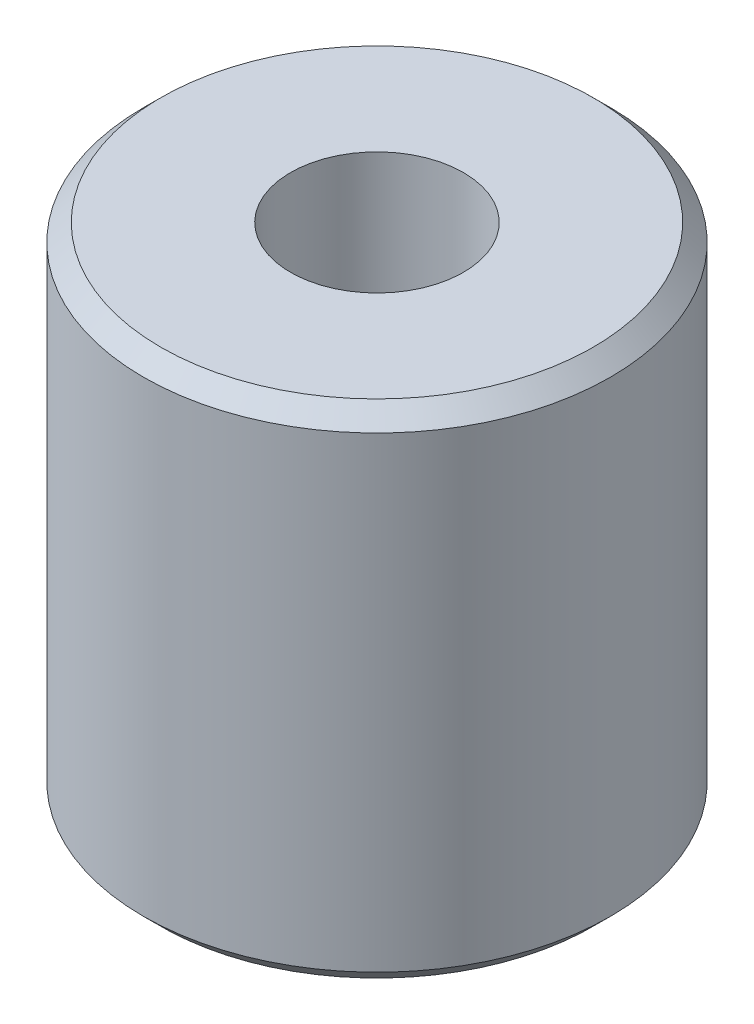
ISO-10303-21;
HEADER;
FILE_DESCRIPTION(('STEP AP214'),'2;1');
FILE_NAME('part.step','',(''),(''),'','','');
FILE_SCHEMA(('AUTOMOTIVE_DESIGN { 1 0 10303 214 1 1 1 1 }'));
ENDSEC;
DATA;
#1=APPLICATION_CONTEXT('core data for automotive mechanical design processes');
#2=APPLICATION_PROTOCOL_DEFINITION('international standard','automotive_design',2000,#1);
#3=PRODUCT_CONTEXT('',#1,'mechanical');
#4=PRODUCT('Part','Part','',(#3));
#5=PRODUCT_RELATED_PRODUCT_CATEGORY('part','',(#4));
#6=PRODUCT_DEFINITION_FORMATION('','',#4);
#7=PRODUCT_DEFINITION_CONTEXT('part definition',#1,'design');
#8=PRODUCT_DEFINITION('design','',#6,#7);
#9=PRODUCT_DEFINITION_SHAPE('','',#8);
#10=(LENGTH_UNIT() NAMED_UNIT(*) SI_UNIT(.MILLI.,.METRE.));
#11=(NAMED_UNIT(*) PLANE_ANGLE_UNIT() SI_UNIT($,.RADIAN.));
#12=(NAMED_UNIT(*) SI_UNIT($,.STERADIAN.) SOLID_ANGLE_UNIT());
#13=UNCERTAINTY_MEASURE_WITH_UNIT(LENGTH_MEASURE(1.E-05),#10,'distance_accuracy_value','');
#14=(GEOMETRIC_REPRESENTATION_CONTEXT(3) GLOBAL_UNCERTAINTY_ASSIGNED_CONTEXT((#13)) GLOBAL_UNIT_ASSIGNED_CONTEXT((#10,
#11,#12)) REPRESENTATION_CONTEXT('',''));
#15=CARTESIAN_POINT('',(0.,0.,0.));
#16=DIRECTION('',(0.,0.,1.));
#17=DIRECTION('',(1.,0.,0.));
#18=AXIS2_PLACEMENT_3D('',#15,#16,#17);
#19=CARTESIAN_POINT('',(0.,0.,0.));
#20=DIRECTION('',(0.,-1.,0.));
#21=DIRECTION('',(0.,0.,-1.));
#22=AXIS2_PLACEMENT_3D('',#19,#20,#21);
#23=PLANE('',#22);
#24=DIRECTION('',(-1.,0.,0.));
#25=VECTOR('',#24,1.);
#26=CARTESIAN_POINT('',(0.,0.,-12.2));
#27=LINE('',#26,#25);
#28=CARTESIAN_POINT('',(2.72213151776325,0.,-12.2));
#29=VERTEX_POINT('',#28);
#30=CARTESIAN_POINT('',(-2.72213151776325,0.,-12.2));
#31=VERTEX_POINT('',#30);
#32=EDGE_CURVE('E55',#29,#31,#27,.T.);
#33=ORIENTED_EDGE('',*,*,#32,.F.);
#34=CARTESIAN_POINT('',(0.,0.,0.));
#35=DIRECTION('',(0.,-1.,0.));
#36=DIRECTION('',(0.,0.,-1.));
#37=AXIS2_PLACEMENT_3D('',#34,#35,#36);
#38=CIRCLE('',#37,12.5);
#39=EDGE_CURVE('E104',#29,#31,#38,.T.);
#40=ORIENTED_EDGE('',*,*,#39,.T.);
#41=EDGE_LOOP('',(#33,#40));
#42=FACE_BOUND('',#41,.T.);
#43=CARTESIAN_POINT('',(0.,0.,0.));
#44=DIRECTION('',(0.,-1.,0.));
#45=DIRECTION('',(0.,0.,-1.));
#46=AXIS2_PLACEMENT_3D('',#43,#44,#45);
#47=CIRCLE('',#46,11.5);
#48=CARTESIAN_POINT('',(0.,0.,-11.5));
#49=VERTEX_POINT('',#48);
#50=EDGE_CURVE('E87',#49,#49,#47,.T.);
#51=ORIENTED_EDGE('',*,*,#50,.F.);
#52=EDGE_LOOP('',(#51));
#53=FACE_BOUND('',#52,.T.);
#54=ADVANCED_FACE('F37',(#42,#53),#23,.T.);
#55=CARTESIAN_POINT('',(0.,0.,0.));
#56=DIRECTION('',(0.,-1.,0.));
#57=DIRECTION('',(0.,0.,-1.));
#58=AXIS2_PLACEMENT_3D('',#55,#56,#57);
#59=CYLINDRICAL_SURFACE('',#58,13.5);
#60=DIRECTION('',(0.,-1.,0.));
#61=VECTOR('',#60,1.);
#62=CARTESIAN_POINT('',(-5.78013840664738,0.,-12.2));
#63=LINE('',#62,#61);
#64=CARTESIAN_POINT('',(-5.78013840664738,1.00000000000001,-12.2));
#65=VERTEX_POINT('',#64);
#66=CARTESIAN_POINT('',(-5.78013840664738,15.4544491975612,-12.2));
#67=VERTEX_POINT('',#66);
#68=EDGE_CURVE('E79',#65,#67,#63,.F.);
#69=ORIENTED_EDGE('',*,*,#68,.F.);
#70=CARTESIAN_POINT('',(0.,1.00000000000001,0.));
#71=DIRECTION('',(0.,-1.,0.));
#72=DIRECTION('',(0.,0.,-1.));
#73=AXIS2_PLACEMENT_3D('',#70,#71,#72);
#74=CIRCLE('',#73,13.5);
#75=CARTESIAN_POINT('',(5.78013840664738,1.00000000000001,-12.2));
#76=VERTEX_POINT('',#75);
#77=EDGE_CURVE('E86',#65,#76,#74,.F.);
#78=ORIENTED_EDGE('',*,*,#77,.T.);
#79=DIRECTION('',(0.,-1.,0.));
#80=VECTOR('',#79,1.);
#81=CARTESIAN_POINT('',(5.78013840664738,0.,-12.2));
#82=LINE('',#81,#80);
#83=CARTESIAN_POINT('',(5.78013840664738,15.4544491975612,-12.2));
#84=VERTEX_POINT('',#83);
#85=EDGE_CURVE('E61',#84,#76,#82,.T.);
#86=ORIENTED_EDGE('',*,*,#85,.F.);
#87=CARTESIAN_POINT('',(-5.7805605229943,15.4540777816083,-12.1998));
#88=CARTESIAN_POINT('',(-5.60377833499795,15.6096181417066,-12.2835547223903));
#89=CARTESIAN_POINT('',(-5.42153564305729,15.7602692502665,-12.3652085168867));
#90=CARTESIAN_POINT('',(-5.04560033762277,16.0504348255241,-12.523324280762));
#91=CARTESIAN_POINT('',(-4.85188464782954,16.1899254224025,-12.599775072566));
#92=CARTESIAN_POINT('',(-4.45138860053311,16.4569640822123,-12.7468047787695));
#93=CARTESIAN_POINT('',(-4.24450502799067,16.5843913573172,-12.8173236475341));
#94=CARTESIAN_POINT('',(-3.81953534537975,16.8237799133292,-12.9503159975259));
#95=CARTESIAN_POINT('',(-3.60145316737217,16.9357465725214,-13.0127922760146));
#96=CARTESIAN_POINT('',(-3.19547179540864,17.1232035257958,-13.1177183118308));
#97=CARTESIAN_POINT('',(-3.00933066214877,17.2016213039732,-13.1617418924223));
#98=CARTESIAN_POINT('',(-2.63061965718643,17.3454068127842,-13.2426319955222));
#99=CARTESIAN_POINT('',(-2.43805246627921,17.4107799078286,-13.2795014598702));
#100=CARTESIAN_POINT('',(-2.04798318554912,17.5271089671152,-13.3452142141676));
#101=CARTESIAN_POINT('',(-1.85050009701545,17.578113186183,-13.3740843626105));
#102=CARTESIAN_POINT('',(-1.45116311219461,17.6649400024044,-13.4232852854299));
#103=CARTESIAN_POINT('',(-1.24930933217448,17.7007630028814,-13.4436162866678));
#104=CARTESIAN_POINT('',(-0.84122570506277,17.756608663976,-13.4753299277904));
#105=CARTESIAN_POINT('',(-0.634974811241519,17.7765156701302,-13.4866470657182));
#106=CARTESIAN_POINT('',(-0.221228827746882,17.7996037202947,-13.4997738775742));
#107=CARTESIAN_POINT('',(-0.0137337250657907,17.8027845891337,-13.5015834519305));
#108=CARTESIAN_POINT('',(0.400744320794949,17.7923377784026,-13.4956427539284));
#109=CARTESIAN_POINT('',(0.607727121305969,17.7787058512224,-13.4878900657455));
#110=CARTESIAN_POINT('',(1.0193593421651,17.7349698678994,-13.4630392251003));
#111=CARTESIAN_POINT('',(1.22400885679909,17.7048664797783,-13.4459414516404));
#112=CARTESIAN_POINT('',(1.61143907482337,17.6322714018055,-13.4047672808428));
#113=CARTESIAN_POINT('',(1.79455206519561,17.5911121459458,-13.3814425706684));
#114=CARTESIAN_POINT('',(2.15655900159296,17.496464736852,-13.3278951480671));
#115=CARTESIAN_POINT('',(2.33545147454067,17.4429723471858,-13.2976700653968));
#116=CARTESIAN_POINT('',(2.86518708955981,17.2650459459745,-13.1973394229946));
#117=CARTESIAN_POINT('',(3.20853338584111,17.1232705211098,-13.1176399980038));
#118=CARTESIAN_POINT('',(3.95379346332797,16.7609880187799,-12.9152000131658));
#119=CARTESIAN_POINT('',(4.34871972273771,16.5296475571014,-12.7866757805522));
#120=CARTESIAN_POINT('',(5.09587075188603,16.0221690645189,-12.5075868659291));
#121=CARTESIAN_POINT('',(5.44838549745121,15.7463694720059,-12.3571894754937));
#122=CARTESIAN_POINT('',(5.7805605229944,15.4540777816082,-12.1998));
#123=B_SPLINE_CURVE_WITH_KNOTS('',3,(#87,#88,#89,#90,#91,#92,#93,#94,#95,#96,#97,#98,#99,#100,
#101,#102,#103,#104,#105,#106,#107,#108,#109,#110,#111,#112,#113,#114,#115,#116,#117,#118,#119,
#120,#121,#122),.UNSPECIFIED.,.F.,.F.,(4,2,2,2,2,2,2,2,2,2,2,2,2,2,2,2,2,4),(0.,
0.749814964274005,1.50119297451126,2.25943754684067,3.01741768047873,3.63702111516616,
4.25636922064916,4.87361188415865,5.4908381481986,6.11250976353929,6.73418788957804,
7.35602310949683,7.97783311194137,8.54460268000425,9.11156722427166,10.2471848575478,
11.668408519565,13.0792841562995),.UNSPECIFIED.);
#124=EDGE_CURVE('E11',#67,#84,#123,.T.);
#125=ORIENTED_EDGE('',*,*,#124,.F.);
#126=EDGE_LOOP('',(#69,#78,#86,#125));
#127=FACE_BOUND('',#126,.T.);
#128=CARTESIAN_POINT('',(0.,28.,0.));
#129=DIRECTION('',(0.,1.,0.));
#130=DIRECTION('',(0.,0.,1.));
#131=AXIS2_PLACEMENT_3D('',#128,#129,#130);
#132=CIRCLE('',#131,13.5);
#133=CARTESIAN_POINT('',(0.,28.,13.5));
#134=VERTEX_POINT('',#133);
#135=EDGE_CURVE('E98',#134,#134,#132,.F.);
#136=ORIENTED_EDGE('',*,*,#135,.T.);
#137=EDGE_LOOP('',(#136));
#138=FACE_BOUND('',#137,.T.);
#139=ADVANCED_FACE('F83',(#127,#138),#59,.T.);
#140=CARTESIAN_POINT('',(13.5,29.,0.));
#141=DIRECTION('',(0.,1.,0.));
#142=DIRECTION('',(0.,0.,1.));
#143=AXIS2_PLACEMENT_3D('',#140,#141,#142);
#144=PLANE('',#143);
#145=CARTESIAN_POINT('',(0.,29.,0.));
#146=DIRECTION('',(0.,-1.,0.));
#147=DIRECTION('',(0.,0.,-1.));
#148=AXIS2_PLACEMENT_3D('',#145,#146,#147);
#149=CIRCLE('',#148,5.);
#150=CARTESIAN_POINT('',(0.,29.,-5.));
#151=VERTEX_POINT('',#150);
#152=EDGE_CURVE('E151',#151,#151,#149,.T.);
#153=ORIENTED_EDGE('',*,*,#152,.T.);
#154=EDGE_LOOP('',(#153));
#155=FACE_BOUND('',#154,.T.);
#156=CARTESIAN_POINT('',(0.,29.,0.));
#157=DIRECTION('',(0.,1.,0.));
#158=DIRECTION('',(0.,0.,1.));
#159=AXIS2_PLACEMENT_3D('',#156,#157,#158);
#160=CIRCLE('',#159,12.5);
#161=CARTESIAN_POINT('',(0.,29.,12.5));
#162=VERTEX_POINT('',#161);
#163=EDGE_CURVE('E101',#162,#162,#160,.T.);
#164=ORIENTED_EDGE('',*,*,#163,.T.);
#165=EDGE_LOOP('',(#164));
#166=FACE_BOUND('',#165,.T.);
#167=ADVANCED_FACE('F129',(#155,#166),#144,.T.);
#168=CARTESIAN_POINT('',(0.,4.,0.));
#169=DIRECTION('',(0.,-1.,0.));
#170=DIRECTION('',(0.,0.,-1.));
#171=AXIS2_PLACEMENT_3D('',#168,#169,#170);
#172=CYLINDRICAL_SURFACE('',#171,11.5);
#173=CARTESIAN_POINT('',(0.,4.,0.));
#174=DIRECTION('',(0.,-1.,0.));
#175=DIRECTION('',(0.,0.,-1.));
#176=AXIS2_PLACEMENT_3D('',#173,#174,#175);
#177=CIRCLE('',#176,11.5);
#178=CARTESIAN_POINT('',(0.,4.,-11.5));
#179=VERTEX_POINT('',#178);
#180=EDGE_CURVE('E90',#179,#179,#177,.T.);
#181=ORIENTED_EDGE('',*,*,#180,.F.);
#182=EDGE_LOOP('',(#181));
#183=FACE_BOUND('',#182,.T.);
#184=ORIENTED_EDGE('',*,*,#50,.T.);
#185=EDGE_LOOP('',(#184));
#186=FACE_BOUND('',#185,.T.);
#187=ADVANCED_FACE('F125',(#183,#186),#172,.F.);
#188=CARTESIAN_POINT('',(0.,4.,0.));
#189=DIRECTION('',(0.,-1.,0.));
#190=DIRECTION('',(0.,0.,-1.));
#191=AXIS2_PLACEMENT_3D('',#188,#189,#190);
#192=PLANE('',#191);
#193=CARTESIAN_POINT('',(0.,4.,0.));
#194=DIRECTION('',(0.,-1.,0.));
#195=DIRECTION('',(0.,0.,-1.));
#196=AXIS2_PLACEMENT_3D('',#193,#194,#195);
#197=CIRCLE('',#196,8.);
#198=CARTESIAN_POINT('',(0.,4.,-8.));
#199=VERTEX_POINT('',#198);
#200=EDGE_CURVE('E148',#199,#199,#197,.T.);
#201=ORIENTED_EDGE('',*,*,#200,.F.);
#202=EDGE_LOOP('',(#201));
#203=FACE_BOUND('',#202,.T.);
#204=ORIENTED_EDGE('',*,*,#180,.T.);
#205=EDGE_LOOP('',(#204));
#206=FACE_BOUND('',#205,.T.);
#207=ADVANCED_FACE('F121',(#203,#206),#192,.T.);
#208=CARTESIAN_POINT('',(0.,28.,0.));
#209=DIRECTION('',(0.,-1.,0.));
#210=DIRECTION('',(0.,0.,-1.));
#211=AXIS2_PLACEMENT_3D('',#208,#209,#210);
#212=CONICAL_SURFACE('',#211,13.5,0.785398163397448);
#213=ORIENTED_EDGE('',*,*,#163,.F.);
#214=EDGE_LOOP('',(#213));
#215=FACE_BOUND('',#214,.T.);
#216=ORIENTED_EDGE('',*,*,#135,.F.);
#217=EDGE_LOOP('',(#216));
#218=FACE_BOUND('',#217,.T.);
#219=ADVANCED_FACE('F117',(#215,#218),#212,.T.);
#220=CARTESIAN_POINT('',(0.,0.,0.));
#221=DIRECTION('',(0.,1.,0.));
#222=DIRECTION('',(0.,0.,1.));
#223=AXIS2_PLACEMENT_3D('',#220,#221,#222);
#224=CONICAL_SURFACE('',#223,12.5,0.785398163397447);
#225=CARTESIAN_POINT('',(-9.37176828665042,2.88408400973769,-12.2));
#226=CARTESIAN_POINT('',(-9.14267745207639,2.74454545763472,-12.2));
#227=CARTESIAN_POINT('',(-8.91215854856363,2.60731543729206,-12.2));
#228=CARTESIAN_POINT('',(-8.44795301301165,2.33819296271562,-12.2));
#229=CARTESIAN_POINT('',(-8.21426561098258,2.20630183810872,-12.2));
#230=CARTESIAN_POINT('',(-7.74252932159776,1.94810270374058,-12.2));
#231=CARTESIAN_POINT('',(-7.50446616942464,1.82182066226694,-12.2));
#232=CARTESIAN_POINT('',(-7.0247149767949,1.57636774438777,-12.2));
#233=CARTESIAN_POINT('',(-6.78302717525875,1.45719640183275,-12.2));
#234=CARTESIAN_POINT('',(-6.29092370764107,1.22471419302888,-12.2));
#235=CARTESIAN_POINT('',(-6.04043007176325,1.11156718990535,-12.2));
#236=CARTESIAN_POINT('',(-5.53526149272942,0.895036357905515,-12.2));
#237=CARTESIAN_POINT('',(-5.28058618015263,0.791653397118208,-12.2));
#238=CARTESIAN_POINT('',(-4.51093332233905,0.498612909588109,-12.2));
#239=CARTESIAN_POINT('',(-3.98932969447108,0.325580054010307,-12.2));
#240=CARTESIAN_POINT('',(-3.15607966554564,0.0982260840564814,-12.2));
#241=CARTESIAN_POINT('',(-2.84960335796196,0.0247293674856625,-12.2));
#242=CARTESIAN_POINT('',(-2.23225572118263,-0.101140306041423,-12.2));
#243=CARTESIAN_POINT('',(-1.92138417853936,-0.153512233433383,-12.2));
#244=CARTESIAN_POINT('',(-1.2994545364014,-0.234828063240896,-12.2));
#245=CARTESIAN_POINT('',(-0.988424110140089,-0.263981715092129,-12.2));
#246=CARTESIAN_POINT('',(-0.365031777384046,-0.298509352151343,-12.2));
#247=CARTESIAN_POINT('',(-0.0526698395893691,-0.303882775235636,-12.2));
#248=CARTESIAN_POINT('',(0.624864186325084,-0.289466292503665,-12.2));
#249=CARTESIAN_POINT('',(0.989948166325427,-0.265223908670282,-12.2));
#250=CARTESIAN_POINT('',(1.71663411409065,-0.185120542255436,-12.2));
#251=CARTESIAN_POINT('',(2.07823535428013,-0.129253092630107,-12.2));
#252=CARTESIAN_POINT('',(2.80035923949408,0.0121922793303664,-12.2));
#253=CARTESIAN_POINT('',(3.16080762078433,0.098144647043071,-12.2));
#254=CARTESIAN_POINT('',(3.87439641503349,0.295832902523423,-12.2));
#255=CARTESIAN_POINT('',(4.22753810134197,0.407564255795477,-12.2));
#256=CARTESIAN_POINT('',(4.98913049690708,0.675063434536766,-12.2));
#257=CARTESIAN_POINT('',(5.39605751134537,0.835139686172447,-12.2));
#258=CARTESIAN_POINT('',(6.19941902437125,1.17995009685797,-12.2));
#259=CARTESIAN_POINT('',(6.59584838682825,1.3646960682566,-12.2));
#260=CARTESIAN_POINT('',(7.38016170001,1.75449411714868,-12.2));
#261=CARTESIAN_POINT('',(7.76801286455964,1.95961165274141,-12.2));
#262=CARTESIAN_POINT('',(8.53481684616307,2.38561379476461,-12.2));
#263=CARTESIAN_POINT('',(8.91377108823664,2.6064958529776,-12.2));
#264=CARTESIAN_POINT('',(9.64766645823823,3.05107731905752,-12.2));
#265=CARTESIAN_POINT('',(10.0029357420179,3.27423783965085,-12.2));
#266=CARTESIAN_POINT('',(10.7073412968225,3.73006773028702,-12.2));
#267=CARTESIAN_POINT('',(11.05647707665,3.96273785698124,-12.2));
#268=CARTESIAN_POINT('',(11.7465532366597,4.43394145592185,-12.2));
#269=CARTESIAN_POINT('',(12.0875373763732,4.67241107380289,-12.2));
#270=CARTESIAN_POINT('',(12.7648142095553,5.15572954426592,-12.2));
#271=CARTESIAN_POINT('',(13.1011082019961,5.40057657445019,-12.2));
#272=CARTESIAN_POINT('',(13.4354386288332,5.64803050331204,-12.2));
#273=B_SPLINE_CURVE_WITH_KNOTS('',3,(#225,#226,#227,#228,#229,#230,#231,#232,#233,#234,#235,
#236,#237,#238,#239,#240,#241,#242,#243,#244,#245,#246,#247,#248,#249,#250,#251,#252,#253,#254,
#255,#256,#257,#258,#259,#260,#261,#262,#263,#264,#265,#266,#267,#268,#269,#270,#271,#272),
.UNSPECIFIED.,.F.,.F.,(4,2,2,2,2,2,2,2,2,2,2,2,2,2,2,2,2,2,2,2,2,2,2,4),(0.,0.804739069096805,
1.60967733687841,2.41801950785296,3.2263086287364,4.05068625546364,4.87513710604342,
6.52071749301024,7.46560833863753,8.41054523009131,9.34684571722639,10.2831683367756,
11.3793394122329,12.4757347259151,13.5862920468991,14.6966541707826,16.0074601786893,
17.3188960921506,18.634691346201,19.9502743913754,21.2087270586596,22.4672800529963,
23.7154959896544,24.9633590691285),.UNSPECIFIED.);
#274=EDGE_CURVE('E48',#76,#29,#273,.F.);
#275=ORIENTED_EDGE('',*,*,#274,.F.);
#276=ORIENTED_EDGE('',*,*,#77,.F.);
#277=EDGE_CURVE('E106',#31,#65,#273,.F.);
#278=ORIENTED_EDGE('',*,*,#277,.F.);
#279=ORIENTED_EDGE('',*,*,#39,.F.);
#280=EDGE_LOOP('',(#275,#276,#278,#279));
#281=FACE_BOUND('',#280,.T.);
#282=ADVANCED_FACE('F113',(#281),#224,.T.);
#283=CARTESIAN_POINT('',(0.,0.,-12.2));
#284=DIRECTION('',(0.,0.,1.));
#285=DIRECTION('',(1.,0.,0.));
#286=AXIS2_PLACEMENT_3D('',#283,#284,#285);
#287=PLANE('',#286);
#288=CARTESIAN_POINT('',(0.,8.,-12.2));
#289=DIRECTION('',(0.,0.,-1.));
#290=DIRECTION('',(-1.,0.,0.));
#291=AXIS2_PLACEMENT_3D('',#288,#289,#290);
#292=CIRCLE('',#291,3.);
#293=CARTESIAN_POINT('',(-3.,8.,-12.2));
#294=VERTEX_POINT('',#293);
#295=EDGE_CURVE('E158',#294,#294,#292,.T.);
#296=ORIENTED_EDGE('',*,*,#295,.F.);
#297=EDGE_LOOP('',(#296));
#298=FACE_BOUND('',#297,.T.);
#299=ORIENTED_EDGE('',*,*,#85,.T.);
#300=ORIENTED_EDGE('',*,*,#274,.T.);
#301=ORIENTED_EDGE('',*,*,#32,.T.);
#302=ORIENTED_EDGE('',*,*,#277,.T.);
#303=ORIENTED_EDGE('',*,*,#68,.T.);
#304=CARTESIAN_POINT('',(0.,0.,-12.2));
#305=DIRECTION('',(0.,0.,1.));
#306=DIRECTION('',(1.,0.,0.));
#307=AXIS2_PLACEMENT_3D('',#304,#305,#306);
#308=CIRCLE('',#307,16.5);
#309=EDGE_CURVE('E75',#84,#67,#308,.T.);
#310=ORIENTED_EDGE('',*,*,#309,.F.);
#311=EDGE_LOOP('',(#299,#300,#301,#302,#303,#310));
#312=FACE_BOUND('',#311,.T.);
#313=ADVANCED_FACE('F78',(#298,#312),#287,.F.);
#314=CARTESIAN_POINT('',(0.,0.,-12.2));
#315=DIRECTION('',(0.,0.,-1.));
#316=DIRECTION('',(-1.,0.,0.));
#317=AXIS2_PLACEMENT_3D('',#314,#315,#316);
#318=CONICAL_SURFACE('',#317,16.5,0.785398163397447);
#319=ORIENTED_EDGE('',*,*,#124,.T.);
#320=ORIENTED_EDGE('',*,*,#309,.T.);
#321=EDGE_LOOP('',(#319,#320));
#322=FACE_BOUND('',#321,.T.);
#323=ADVANCED_FACE('F74',(#322),#318,.F.);
#324=CARTESIAN_POINT('',(0.,14.,0.));
#325=DIRECTION('',(0.,-1.,0.));
#326=DIRECTION('',(0.,0.,-1.));
#327=AXIS2_PLACEMENT_3D('',#324,#325,#326);
#328=CYLINDRICAL_SURFACE('',#327,8.);
#329=CARTESIAN_POINT('',(-3.,8.,-7.41619848709566));
#330=CARTESIAN_POINT('',(-3.00000608211288,7.8379850325166,-7.41619281215226));
#331=CARTESIAN_POINT('',(-2.98683195095364,7.67601015487381,-7.42156520296313));
#332=CARTESIAN_POINT('',(-2.93472375787483,7.35694383406478,-7.44232318425766));
#333=CARTESIAN_POINT('',(-2.89579046745932,7.19985224478832,-7.45770847484804));
#334=CARTESIAN_POINT('',(-2.79379315222297,6.89524925681116,-7.49650960610891));
#335=CARTESIAN_POINT('',(-2.73078694533005,6.74771588670809,-7.51990619151695));
#336=CARTESIAN_POINT('',(-2.58263713485087,6.46525620635206,-7.57206268400017));
#337=CARTESIAN_POINT('',(-2.49748688189993,6.33033369943215,-7.60082420131042));
#338=CARTESIAN_POINT('',(-2.30293322748412,6.0702193767573,-7.66207149335192));
#339=CARTESIAN_POINT('',(-2.19260762426636,5.945742940742,-7.69466683848217));
#340=CARTESIAN_POINT('',(-1.95279167955762,5.71655437065623,-7.75899501256083));
#341=CARTESIAN_POINT('',(-1.82329726051329,5.61184645251607,-7.79072765629295));
#342=CARTESIAN_POINT('',(-1.54338931035527,5.421720975409,-7.8510574787339));
#343=CARTESIAN_POINT('',(-1.39241389507607,5.33708105056834,-7.87951122447087));
#344=CARTESIAN_POINT('',(-1.07711154393048,5.19469765495012,-7.92876015947619));
#345=CARTESIAN_POINT('',(-0.912789261867064,5.13694485601603,-7.94955800433994));
#346=CARTESIAN_POINT('',(-0.582978683353667,5.05248420845078,-7.98037394206897));
#347=CARTESIAN_POINT('',(-0.417846394563195,5.02454474511908,-7.99081830429549));
#348=CARTESIAN_POINT('',(-0.0849287275895649,4.99655759811002,-8.0012802821588));
#349=CARTESIAN_POINT('',(0.082855770125682,4.9965008447626,-8.0013012882982));
#350=CARTESIAN_POINT('',(0.407487086128941,5.02356352293033,-7.99118531807773));
#351=CARTESIAN_POINT('',(0.564464356533757,5.04933859589756,-7.98155083993306));
#352=CARTESIAN_POINT('',(0.87167843596883,5.12507183045118,-7.95386549864585));
#353=CARTESIAN_POINT('',(1.02191476686077,5.17503170452435,-7.93581403951378));
#354=CARTESIAN_POINT('',(1.31397803460604,5.29834090335142,-7.89275538334835));
#355=CARTESIAN_POINT('',(1.45565078457398,5.37202001053579,-7.86765078939303));
#356=CARTESIAN_POINT('',(1.72497321591577,5.5403841938598,-7.81302620451409));
#357=CARTESIAN_POINT('',(1.85261835386705,5.63507604603903,-7.78350479028858));
#358=CARTESIAN_POINT('',(2.09818097359933,5.84925457256232,-7.72105059308269));
#359=CARTESIAN_POINT('',(2.21509229051721,5.96986783128531,-7.68801927514871));
#360=CARTESIAN_POINT('',(2.42740791139661,6.22918598665867,-7.62364921304341));
#361=CARTESIAN_POINT('',(2.52280681389449,6.36789541323143,-7.59231089545926));
#362=CARTESIAN_POINT('',(2.69131223613209,6.66343893487737,-7.53425406951149));
#363=CARTESIAN_POINT('',(2.76387695690677,6.82060698717146,-7.50765354114235));
#364=CARTESIAN_POINT('',(2.88112928869848,7.14619245012777,-7.4634487707231));
#365=CARTESIAN_POINT('',(2.925832412077,7.31460354312571,-7.44583952363152));
#366=CARTESIAN_POINT('',(2.98380383422379,7.64795192467549,-7.4227919449154));
#367=CARTESIAN_POINT('',(2.99867042318746,7.81256821108394,-7.41673570495336));
#368=CARTESIAN_POINT('',(3.00115771271731,8.14201871347183,-7.41573079037772));
#369=CARTESIAN_POINT('',(2.98878522187311,8.30685286470189,-7.42077934004762));
#370=CARTESIAN_POINT('',(2.93859467040517,8.62385984457827,-7.44078763262529));
#371=CARTESIAN_POINT('',(2.90201236668504,8.7762622715301,-7.45526552433718));
#372=CARTESIAN_POINT('',(2.80599549281221,9.07269588943961,-7.49192974091902));
#373=CARTESIAN_POINT('',(2.74655624069231,9.21672535833606,-7.51411764500121));
#374=CARTESIAN_POINT('',(2.60400584550571,9.49832887615263,-7.56472486232391));
#375=CARTESIAN_POINT('',(2.52009090354098,9.63545858427474,-7.59334657784192));
#376=CARTESIAN_POINT('',(2.33182635724954,9.89425796345202,-7.6532562858852));
#377=CARTESIAN_POINT('',(2.22746927392868,10.0159219492493,-7.68454525188137));
#378=CARTESIAN_POINT('',(1.99345468180189,10.2483367463902,-7.74866093106386));
#379=CARTESIAN_POINT('',(1.86261268298213,10.3579068175375,-7.7814593871406));
#380=CARTESIAN_POINT('',(1.5835949435063,10.5536767351789,-7.84299749926599));
#381=CARTESIAN_POINT('',(1.43541914664534,10.6398765058917,-7.87173714215327));
#382=CARTESIAN_POINT('',(1.12603265893695,10.7858921123992,-7.92189971409105));
#383=CARTESIAN_POINT('',(0.964868866129251,10.8457982475852,-7.9433476267602));
#384=CARTESIAN_POINT('',(0.633763775046507,10.9373128276998,-7.97658873425142));
#385=CARTESIAN_POINT('',(0.463826641447184,10.9689345708448,-7.98838646598825));
#386=CARTESIAN_POINT('',(0.13067117054763,11.0015488055097,-8.00056814634147));
#387=CARTESIAN_POINT('',(-0.0323615361216915,11.004218966118,-8.00157721907528));
#388=CARTESIAN_POINT('',(-0.356453572824849,10.9831696811092,-7.99369779618447));
#389=CARTESIAN_POINT('',(-0.517513138490516,10.9594534182283,-7.98481049426262));
#390=CARTESIAN_POINT('',(-0.829096496754254,10.8874822970128,-7.95842179207541));
#391=CARTESIAN_POINT('',(-0.979781462137671,10.8398401882433,-7.9411358275603));
#392=CARTESIAN_POINT('',(-1.27103094601278,10.7219799732313,-7.89975567241984));
#393=CARTESIAN_POINT('',(-1.41159354255109,10.6517575933905,-7.87566019311345));
#394=CARTESIAN_POINT('',(-1.68508035398882,10.4873721129904,-7.8218123660013));
#395=CARTESIAN_POINT('',(-1.81743509769369,10.3923267189717,-7.79186480217587));
#396=CARTESIAN_POINT('',(-2.06483469504674,10.1823843396248,-7.72999015389759));
#397=CARTESIAN_POINT('',(-2.17987334251185,10.0674802683844,-7.69806236548317));
#398=CARTESIAN_POINT('',(-2.39562428472387,9.81387173670976,-7.63376259478074));
#399=CARTESIAN_POINT('',(-2.49525999632032,9.67423119569092,-7.60145610697262));
#400=CARTESIAN_POINT('',(-2.66969419113706,9.37916826085381,-7.54196650008334));
#401=CARTESIAN_POINT('',(-2.74449009756384,9.22374423189476,-7.51478391266386));
#402=CARTESIAN_POINT('',(-2.86931773948448,8.89408863804739,-7.46804539702406));
#403=CARTESIAN_POINT('',(-2.91812005798766,8.71933126696959,-7.44887606566003));
#404=CARTESIAN_POINT('',(-2.98344713444438,8.36302945609526,-7.42295988688337));
#405=CARTESIAN_POINT('',(-2.99999318680184,8.18148957460557,-7.41620484418155));
#406=CARTESIAN_POINT('',(-3.,8.,-7.41619848709566));
#407=B_SPLINE_CURVE_WITH_KNOTS('',3,(#329,#330,#331,#332,#333,#334,#335,#336,#337,#338,#339,
#340,#341,#342,#343,#344,#345,#346,#347,#348,#349,#350,#351,#352,#353,#354,#355,#356,#357,#358,
#359,#360,#361,#362,#363,#364,#365,#366,#367,#368,#369,#370,#371,#372,#373,#374,#375,#376,#377,
#378,#379,#380,#381,#382,#383,#384,#385,#386,#387,#388,#389,#390,#391,#392,#393,#394,#395,#396,
#397,#398,#399,#400,#401,#402,#403,#404,#405,#406),.UNSPECIFIED.,.T.,.F.,(4,2,2,2,2,2,2,2,2,2,2,
2,2,2,2,2,2,2,2,2,2,2,2,2,2,2,2,2,2,2,2,2,2,2,2,2,2,2,4),(0.,0.485369082889299,
0.970723629307671,1.45491971362402,1.93926135947583,2.44549304813252,2.95183257656962,
3.47540144283838,3.99878852773656,4.49960036990354,5.00024930820711,5.47612945617385,
5.95204330537667,6.43488262432332,6.91787787268948,7.42913350142746,7.94051735665666,
8.46325184520833,8.9856950329059,9.47931315500612,9.9728079079741,10.4428769187604,
10.9130422687869,11.4008312203128,11.8887989695235,12.4077003400689,12.9266033932,
13.4437101779998,13.9605737113989,14.4473144111951,14.933996406586,15.4088054802742,
15.883704470453,16.3785664737361,16.8736054180957,17.394771991038,17.9159926110813,
18.4600635776149,19.0037752466575),.UNSPECIFIED.);
#408=CARTESIAN_POINT('',(-3.,8.,-7.41619848709566));
#409=VERTEX_POINT('',#408);
#410=EDGE_CURVE('E161',#409,#409,#407,.T.);
#411=ORIENTED_EDGE('',*,*,#410,.F.);
#412=EDGE_LOOP('',(#411));
#413=FACE_BOUND('',#412,.T.);
#414=CARTESIAN_POINT('',(0.,14.,0.));
#415=DIRECTION('',(0.,-1.,0.));
#416=DIRECTION('',(0.,0.,-1.));
#417=AXIS2_PLACEMENT_3D('',#414,#415,#416);
#418=CIRCLE('',#417,8.);
#419=CARTESIAN_POINT('',(0.,14.,-8.));
#420=VERTEX_POINT('',#419);
#421=EDGE_CURVE('E80',#420,#420,#418,.T.);
#422=ORIENTED_EDGE('',*,*,#421,.F.);
#423=EDGE_LOOP('',(#422));
#424=FACE_BOUND('',#423,.T.);
#425=ORIENTED_EDGE('',*,*,#200,.T.);
#426=EDGE_LOOP('',(#425));
#427=FACE_BOUND('',#426,.T.);
#428=ADVANCED_FACE('F180',(#413,#424,#427),#328,.F.);
#429=CARTESIAN_POINT('',(0.,14.,0.));
#430=DIRECTION('',(0.,-1.,0.));
#431=DIRECTION('',(0.,0.,-1.));
#432=AXIS2_PLACEMENT_3D('',#429,#430,#431);
#433=PLANE('',#432);
#434=CARTESIAN_POINT('',(0.,14.,0.));
#435=DIRECTION('',(0.,-1.,0.));
#436=DIRECTION('',(0.,0.,-1.));
#437=AXIS2_PLACEMENT_3D('',#434,#435,#436);
#438=CIRCLE('',#437,5.);
#439=CARTESIAN_POINT('',(0.,14.,-5.));
#440=VERTEX_POINT('',#439);
#441=EDGE_CURVE('E155',#440,#440,#438,.T.);
#442=ORIENTED_EDGE('',*,*,#441,.F.);
#443=EDGE_LOOP('',(#442));
#444=FACE_BOUND('',#443,.T.);
#445=ORIENTED_EDGE('',*,*,#421,.T.);
#446=EDGE_LOOP('',(#445));
#447=FACE_BOUND('',#446,.T.);
#448=ADVANCED_FACE('F176',(#444,#447),#433,.T.);
#449=CARTESIAN_POINT('',(0.,29.,0.));
#450=DIRECTION('',(0.,-1.,0.));
#451=DIRECTION('',(0.,0.,-1.));
#452=AXIS2_PLACEMENT_3D('',#449,#450,#451);
#453=CYLINDRICAL_SURFACE('',#452,5.);
#454=CARTESIAN_POINT('',(0.,29.,-5.));
#455=CARTESIAN_POINT('',(0.,28.84375,-5.));
#456=CARTESIAN_POINT('',(0.,28.6875,-5.));
#457=CARTESIAN_POINT('',(0.,28.375,-5.));
#458=CARTESIAN_POINT('',(0.,28.21875,-5.));
#459=CARTESIAN_POINT('',(0.,27.90625,-5.));
#460=CARTESIAN_POINT('',(0.,27.75,-5.));
#461=CARTESIAN_POINT('',(0.,27.4375,-5.));
#462=CARTESIAN_POINT('',(0.,27.28125,-5.));
#463=CARTESIAN_POINT('',(0.,26.96875,-5.));
#464=CARTESIAN_POINT('',(0.,26.8125,-5.));
#465=CARTESIAN_POINT('',(0.,26.5,-5.));
#466=CARTESIAN_POINT('',(0.,26.34375,-5.));
#467=CARTESIAN_POINT('',(0.,26.03125,-5.));
#468=CARTESIAN_POINT('',(0.,25.875,-5.));
#469=CARTESIAN_POINT('',(0.,25.5625,-5.));
#470=CARTESIAN_POINT('',(0.,25.40625,-5.));
#471=CARTESIAN_POINT('',(0.,25.09375,-5.));
#472=CARTESIAN_POINT('',(0.,24.9375,-5.));
#473=CARTESIAN_POINT('',(0.,24.625,-5.));
#474=CARTESIAN_POINT('',(0.,24.46875,-5.));
#475=CARTESIAN_POINT('',(0.,24.15625,-5.));
#476=CARTESIAN_POINT('',(0.,24.,-5.));
#477=CARTESIAN_POINT('',(0.,23.6875,-5.));
#478=CARTESIAN_POINT('',(0.,23.53125,-5.));
#479=CARTESIAN_POINT('',(0.,23.21875,-5.));
#480=CARTESIAN_POINT('',(0.,23.0625,-5.));
#481=CARTESIAN_POINT('',(0.,22.75,-5.));
#482=CARTESIAN_POINT('',(0.,22.59375,-5.));
#483=CARTESIAN_POINT('',(0.,22.28125,-5.));
#484=CARTESIAN_POINT('',(0.,22.125,-5.));
#485=CARTESIAN_POINT('',(0.,21.8125,-5.));
#486=CARTESIAN_POINT('',(0.,21.65625,-5.));
#487=CARTESIAN_POINT('',(0.,21.34375,-5.));
#488=CARTESIAN_POINT('',(0.,21.1875,-5.));
#489=CARTESIAN_POINT('',(0.,20.875,-5.));
#490=CARTESIAN_POINT('',(0.,20.71875,-5.));
#491=CARTESIAN_POINT('',(0.,20.40625,-5.));
#492=CARTESIAN_POINT('',(0.,20.25,-5.));
#493=CARTESIAN_POINT('',(0.,19.9375,-5.));
#494=CARTESIAN_POINT('',(0.,19.78125,-5.));
#495=CARTESIAN_POINT('',(0.,19.46875,-5.));
#496=CARTESIAN_POINT('',(0.,19.3125,-5.));
#497=CARTESIAN_POINT('',(0.,19.,-5.));
#498=CARTESIAN_POINT('',(0.,18.84375,-5.));
#499=CARTESIAN_POINT('',(0.,18.53125,-5.));
#500=CARTESIAN_POINT('',(0.,18.375,-5.));
#501=CARTESIAN_POINT('',(0.,18.0625,-5.));
#502=CARTESIAN_POINT('',(0.,17.90625,-5.));
#503=CARTESIAN_POINT('',(0.,17.59375,-5.));
#504=CARTESIAN_POINT('',(0.,17.4375,-5.));
#505=CARTESIAN_POINT('',(0.,17.125,-5.));
#506=CARTESIAN_POINT('',(0.,16.96875,-5.));
#507=CARTESIAN_POINT('',(0.,16.65625,-5.));
#508=CARTESIAN_POINT('',(0.,16.5,-5.));
#509=CARTESIAN_POINT('',(0.,16.1875,-5.));
#510=CARTESIAN_POINT('',(0.,16.03125,-5.));
#511=CARTESIAN_POINT('',(0.,15.71875,-5.));
#512=CARTESIAN_POINT('',(0.,15.5625,-5.));
#513=CARTESIAN_POINT('',(0.,15.25,-5.));
#514=CARTESIAN_POINT('',(0.,15.09375,-5.));
#515=CARTESIAN_POINT('',(0.,14.78125,-5.));
#516=CARTESIAN_POINT('',(0.,14.625,-5.));
#517=CARTESIAN_POINT('',(0.,14.3125,-5.));
#518=CARTESIAN_POINT('',(0.,14.15625,-5.));
#519=CARTESIAN_POINT('',(0.,14.,-5.));
#520=B_SPLINE_CURVE_WITH_KNOTS('',3,(#454,#455,#456,#457,#458,#459,#460,#461,#462,#463,#464,
#465,#466,#467,#468,#469,#470,#471,#472,#473,#474,#475,#476,#477,#478,#479,#480,#481,#482,#483,
#484,#485,#486,#487,#488,#489,#490,#491,#492,#493,#494,#495,#496,#497,#498,#499,#500,#501,#502,
#503,#504,#505,#506,#507,#508,#509,#510,#511,#512,#513,#514,#515,#516,#517,#518,#519),
.UNSPECIFIED.,.F.,.F.,(4,2,2,2,2,2,2,2,2,2,2,2,2,2,2,2,2,2,2,2,2,2,2,2,2,2,2,2,2,2,2,2,4),(0.,
0.468749999999997,0.937499999999997,1.40625,1.875,2.34375,2.8125,3.28125,3.75,4.21875,4.6875,
5.15625,5.625,6.09375,6.5625,7.03125,7.5,7.96875,8.4375,8.90625,9.375,9.84375,10.3125,10.78125,
11.25,11.71875,12.1875,12.65625,13.125,13.59375,14.0625,14.53125,15.),.UNSPECIFIED.);
#521=EDGE_CURVE('BSEAM172',#151,#440,#520,.T.);
#522=ORIENTED_EDGE('',*,*,#152,.F.);
#523=ORIENTED_EDGE('',*,*,#441,.T.);
#524=ORIENTED_EDGE('',*,*,#521,.T.);
#525=ORIENTED_EDGE('',*,*,#521,.F.);
#526=EDGE_LOOP('',(#522,#524,#523,#525));
#527=FACE_BOUND('',#526,.T.);
#528=ADVANCED_FACE('F172',(#527),#453,.F.);
#529=CARTESIAN_POINT('',(0.,8.,13.501));
#530=DIRECTION('',(0.,0.,-1.));
#531=DIRECTION('',(-1.,0.,0.));
#532=AXIS2_PLACEMENT_3D('',#529,#530,#531);
#533=CYLINDRICAL_SURFACE('',#532,3.);
#534=ORIENTED_EDGE('',*,*,#295,.T.);
#535=EDGE_LOOP('',(#534));
#536=FACE_BOUND('',#535,.T.);
#537=ORIENTED_EDGE('',*,*,#410,.T.);
#538=EDGE_LOOP('',(#537));
#539=FACE_BOUND('',#538,.T.);
#540=ADVANCED_FACE('F167',(#536,#539),#533,.F.);
#541=CLOSED_SHELL('',(#54,#139,#167,#187,#207,#219,#282,#313,#323,#428,#448,#528,#540));
#542=MANIFOLD_SOLID_BREP('B2',#541);
#543=ADVANCED_BREP_SHAPE_REPRESENTATION('',(#18,#542),#14);
#544=SHAPE_DEFINITION_REPRESENTATION(#9,#543);
ENDSEC;
END-ISO-10303-21;
